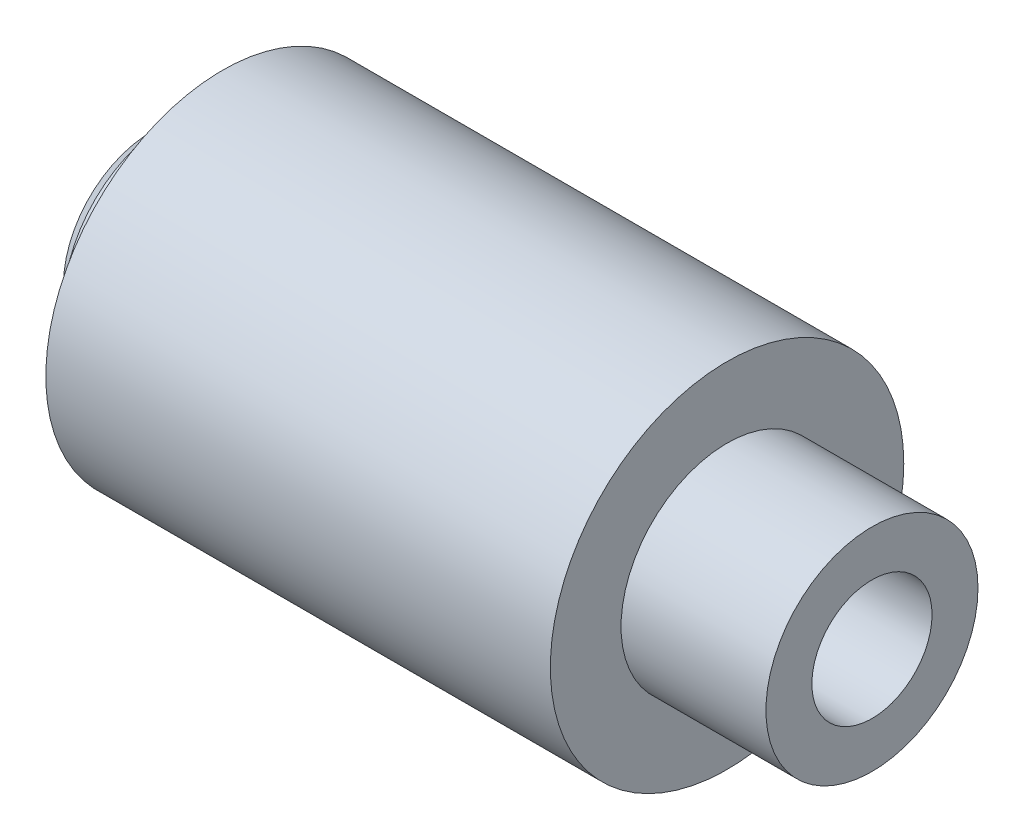
ISO-10303-21;
HEADER;
FILE_DESCRIPTION(('STEP AP214'),'2;1');
FILE_NAME('part.step','',(''),(''),'','','');
FILE_SCHEMA(('AUTOMOTIVE_DESIGN { 1 0 10303 214 1 1 1 1 }'));
ENDSEC;
DATA;
#1=APPLICATION_CONTEXT('core data for automotive mechanical design processes');
#2=APPLICATION_PROTOCOL_DEFINITION('international standard','automotive_design',2000,#1);
#3=PRODUCT_CONTEXT('',#1,'mechanical');
#4=PRODUCT('Part','Part','',(#3));
#5=PRODUCT_RELATED_PRODUCT_CATEGORY('part','',(#4));
#6=PRODUCT_DEFINITION_FORMATION('','',#4);
#7=PRODUCT_DEFINITION_CONTEXT('part definition',#1,'design');
#8=PRODUCT_DEFINITION('design','',#6,#7);
#9=PRODUCT_DEFINITION_SHAPE('','',#8);
#10=(LENGTH_UNIT() NAMED_UNIT(*) SI_UNIT(.MILLI.,.METRE.));
#11=(NAMED_UNIT(*) PLANE_ANGLE_UNIT() SI_UNIT($,.RADIAN.));
#12=(NAMED_UNIT(*) SI_UNIT($,.STERADIAN.) SOLID_ANGLE_UNIT());
#13=UNCERTAINTY_MEASURE_WITH_UNIT(LENGTH_MEASURE(1.E-05),#10,'distance_accuracy_value','');
#14=(GEOMETRIC_REPRESENTATION_CONTEXT(3) GLOBAL_UNCERTAINTY_ASSIGNED_CONTEXT((#13)) GLOBAL_UNIT_ASSIGNED_CONTEXT((#10,
#11,#12)) REPRESENTATION_CONTEXT('',''));
#15=CARTESIAN_POINT('',(0.,0.,0.));
#16=DIRECTION('',(0.,0.,1.));
#17=DIRECTION('',(1.,0.,0.));
#18=AXIS2_PLACEMENT_3D('',#15,#16,#17);
#19=CARTESIAN_POINT('',(14.275,0.,0.));
#20=DIRECTION('',(-1.,0.,0.));
#21=DIRECTION('',(0.,0.,1.));
#22=AXIS2_PLACEMENT_3D('',#19,#20,#21);
#23=CYLINDRICAL_SURFACE('',#22,5.);
#24=CARTESIAN_POINT('',(14.275,0.,0.));
#25=DIRECTION('',(1.,0.,0.));
#26=DIRECTION('',(0.,0.,-1.));
#27=AXIS2_PLACEMENT_3D('',#24,#25,#26);
#28=CIRCLE('',#27,5.);
#29=CARTESIAN_POINT('',(14.275,0.,-5.));
#30=VERTEX_POINT('',#29);
#31=EDGE_CURVE('E51',#30,#30,#28,.T.);
#32=ORIENTED_EDGE('',*,*,#31,.F.);
#33=EDGE_LOOP('',(#32));
#34=FACE_BOUND('',#33,.T.);
#35=CARTESIAN_POINT('',(0.,0.,0.));
#36=DIRECTION('',(1.,0.,0.));
#37=DIRECTION('',(0.,0.,-1.));
#38=AXIS2_PLACEMENT_3D('',#35,#36,#37);
#39=CIRCLE('',#38,5.);
#40=CARTESIAN_POINT('',(0.,0.,-5.));
#41=VERTEX_POINT('',#40);
#42=EDGE_CURVE('E54',#41,#41,#39,.T.);
#43=ORIENTED_EDGE('',*,*,#42,.T.);
#44=EDGE_LOOP('',(#43));
#45=FACE_BOUND('',#44,.T.);
#46=ADVANCED_FACE('F31',(#34,#45),#23,.T.);
#47=CARTESIAN_POINT('',(14.275,0.,0.));
#48=DIRECTION('',(1.,0.,0.));
#49=DIRECTION('',(0.,0.,-1.));
#50=AXIS2_PLACEMENT_3D('',#47,#48,#49);
#51=PLANE('',#50);
#52=CARTESIAN_POINT('',(14.275,0.,0.));
#53=DIRECTION('',(1.,0.,0.));
#54=DIRECTION('',(0.,0.,-1.));
#55=AXIS2_PLACEMENT_3D('',#52,#53,#54);
#56=CIRCLE('',#55,3.);
#57=CARTESIAN_POINT('',(14.275,0.,-3.));
#58=VERTEX_POINT('',#57);
#59=EDGE_CURVE('E10',#58,#58,#56,.T.);
#60=ORIENTED_EDGE('',*,*,#59,.F.);
#61=EDGE_LOOP('',(#60));
#62=FACE_BOUND('',#61,.T.);
#63=ORIENTED_EDGE('',*,*,#31,.T.);
#64=EDGE_LOOP('',(#63));
#65=FACE_BOUND('',#64,.T.);
#66=ADVANCED_FACE('F76',(#62,#65),#51,.T.);
#67=CARTESIAN_POINT('',(0.,0.,0.));
#68=DIRECTION('',(1.,0.,0.));
#69=DIRECTION('',(0.,0.,-1.));
#70=AXIS2_PLACEMENT_3D('',#67,#68,#69);
#71=PLANE('',#70);
#72=CARTESIAN_POINT('',(0.,0.,0.));
#73=DIRECTION('',(-1.,0.,0.));
#74=DIRECTION('',(0.,0.,1.));
#75=AXIS2_PLACEMENT_3D('',#72,#73,#74);
#76=CIRCLE('',#75,3.);
#77=CARTESIAN_POINT('',(0.,0.,3.));
#78=VERTEX_POINT('',#77);
#79=EDGE_CURVE('E48',#78,#78,#76,.T.);
#80=ORIENTED_EDGE('',*,*,#79,.F.);
#81=EDGE_LOOP('',(#80));
#82=FACE_BOUND('',#81,.T.);
#83=ORIENTED_EDGE('',*,*,#42,.F.);
#84=EDGE_LOOP('',(#83));
#85=FACE_BOUND('',#84,.T.);
#86=ADVANCED_FACE('F81',(#82,#85),#71,.F.);
#87=CARTESIAN_POINT('',(-2.,0.,0.));
#88=DIRECTION('',(1.,0.,0.));
#89=DIRECTION('',(0.,0.,-1.));
#90=AXIS2_PLACEMENT_3D('',#87,#88,#89);
#91=CYLINDRICAL_SURFACE('',#90,3.);
#92=CARTESIAN_POINT('',(-1.49999999999999,0.,0.));
#93=DIRECTION('',(-1.,0.,0.));
#94=DIRECTION('',(0.,0.,1.));
#95=AXIS2_PLACEMENT_3D('',#92,#93,#94);
#96=CIRCLE('',#95,3.);
#97=CARTESIAN_POINT('',(-1.49999999999999,0.,3.));
#98=VERTEX_POINT('',#97);
#99=EDGE_CURVE('E35',#98,#98,#96,.F.);
#100=ORIENTED_EDGE('',*,*,#99,.T.);
#101=EDGE_LOOP('',(#100));
#102=FACE_BOUND('',#101,.T.);
#103=ORIENTED_EDGE('',*,*,#79,.T.);
#104=EDGE_LOOP('',(#103));
#105=FACE_BOUND('',#104,.T.);
#106=ADVANCED_FACE('F71',(#102,#105),#91,.T.);
#107=CARTESIAN_POINT('',(-2.,0.,0.));
#108=DIRECTION('',(-1.,0.,0.));
#109=DIRECTION('',(0.,0.,1.));
#110=AXIS2_PLACEMENT_3D('',#107,#108,#109);
#111=PLANE('',#110);
#112=CARTESIAN_POINT('',(-2.,0.,0.));
#113=DIRECTION('',(-1.,0.,0.));
#114=DIRECTION('',(0.,0.,1.));
#115=AXIS2_PLACEMENT_3D('',#112,#113,#114);
#116=CIRCLE('',#115,1.69999999999999);
#117=CARTESIAN_POINT('',(-2.,0.,1.69999999999999));
#118=VERTEX_POINT('',#117);
#119=EDGE_CURVE('E107',#118,#118,#116,.T.);
#120=ORIENTED_EDGE('',*,*,#119,.F.);
#121=EDGE_LOOP('',(#120));
#122=FACE_BOUND('',#121,.T.);
#123=CARTESIAN_POINT('',(-2.,0.,0.));
#124=DIRECTION('',(-1.,0.,0.));
#125=DIRECTION('',(0.,0.,1.));
#126=AXIS2_PLACEMENT_3D('',#123,#124,#125);
#127=CIRCLE('',#126,2.5);
#128=CARTESIAN_POINT('',(-2.,0.,2.5));
#129=VERTEX_POINT('',#128);
#130=EDGE_CURVE('E43',#129,#129,#127,.T.);
#131=ORIENTED_EDGE('',*,*,#130,.T.);
#132=EDGE_LOOP('',(#131));
#133=FACE_BOUND('',#132,.T.);
#134=ADVANCED_FACE('F59',(#122,#133),#111,.T.);
#135=CARTESIAN_POINT('',(-2.,0.,0.));
#136=DIRECTION('',(1.,0.,0.));
#137=DIRECTION('',(0.,0.,-1.));
#138=AXIS2_PLACEMENT_3D('',#135,#136,#137);
#139=CONICAL_SURFACE('',#138,2.5,0.785398163397448);
#140=ORIENTED_EDGE('',*,*,#99,.F.);
#141=EDGE_LOOP('',(#140));
#142=FACE_BOUND('',#141,.T.);
#143=ORIENTED_EDGE('',*,*,#130,.F.);
#144=EDGE_LOOP('',(#143));
#145=FACE_BOUND('',#144,.T.);
#146=ADVANCED_FACE('F33',(#142,#145),#139,.T.);
#147=CARTESIAN_POINT('',(18.375,0.,0.));
#148=DIRECTION('',(-1.,0.,0.));
#149=DIRECTION('',(0.,0.,1.));
#150=AXIS2_PLACEMENT_3D('',#147,#148,#149);
#151=CYLINDRICAL_SURFACE('',#150,3.);
#152=CARTESIAN_POINT('',(18.375,0.,0.));
#153=DIRECTION('',(1.,0.,0.));
#154=DIRECTION('',(0.,0.,-1.));
#155=AXIS2_PLACEMENT_3D('',#152,#153,#154);
#156=CIRCLE('',#155,3.);
#157=CARTESIAN_POINT('',(18.375,0.,-3.));
#158=VERTEX_POINT('',#157);
#159=EDGE_CURVE('E46',#158,#158,#156,.T.);
#160=ORIENTED_EDGE('',*,*,#159,.F.);
#161=EDGE_LOOP('',(#160));
#162=FACE_BOUND('',#161,.T.);
#163=ORIENTED_EDGE('',*,*,#59,.T.);
#164=EDGE_LOOP('',(#163));
#165=FACE_BOUND('',#164,.T.);
#166=ADVANCED_FACE('F62',(#162,#165),#151,.T.);
#167=CARTESIAN_POINT('',(18.375,0.,0.));
#168=DIRECTION('',(1.,0.,0.));
#169=DIRECTION('',(0.,0.,-1.));
#170=AXIS2_PLACEMENT_3D('',#167,#168,#169);
#171=PLANE('',#170);
#172=CARTESIAN_POINT('',(18.375,0.,0.));
#173=DIRECTION('',(1.,0.,0.));
#174=DIRECTION('',(0.,0.,-1.));
#175=AXIS2_PLACEMENT_3D('',#172,#173,#174);
#176=CIRCLE('',#175,1.69999999999999);
#177=CARTESIAN_POINT('',(18.375,0.,-1.69999999999999));
#178=VERTEX_POINT('',#177);
#179=EDGE_CURVE('E104',#178,#178,#176,.T.);
#180=ORIENTED_EDGE('',*,*,#179,.F.);
#181=EDGE_LOOP('',(#180));
#182=FACE_BOUND('',#181,.T.);
#183=ORIENTED_EDGE('',*,*,#159,.T.);
#184=EDGE_LOOP('',(#183));
#185=FACE_BOUND('',#184,.T.);
#186=ADVANCED_FACE('F68',(#182,#185),#171,.T.);
#187=CARTESIAN_POINT('',(18.375,0.,0.));
#188=DIRECTION('',(1.,0.,0.));
#189=DIRECTION('',(0.,0.,-1.));
#190=AXIS2_PLACEMENT_3D('',#187,#188,#189);
#191=CYLINDRICAL_SURFACE('',#190,1.69999999999999);
#192=ORIENTED_EDGE('',*,*,#179,.T.);
#193=EDGE_LOOP('',(#192));
#194=FACE_BOUND('',#193,.T.);
#195=ORIENTED_EDGE('',*,*,#119,.T.);
#196=EDGE_LOOP('',(#195));
#197=FACE_BOUND('',#196,.T.);
#198=ADVANCED_FACE('F95',(#194,#197),#191,.F.);
#199=CLOSED_SHELL('',(#46,#66,#86,#106,#134,#146,#166,#186,#198));
#200=MANIFOLD_SOLID_BREP('B2',#199);
#201=ADVANCED_BREP_SHAPE_REPRESENTATION('',(#18,#200),#14);
#202=SHAPE_DEFINITION_REPRESENTATION(#9,#201);
ENDSEC;
END-ISO-10303-21;
